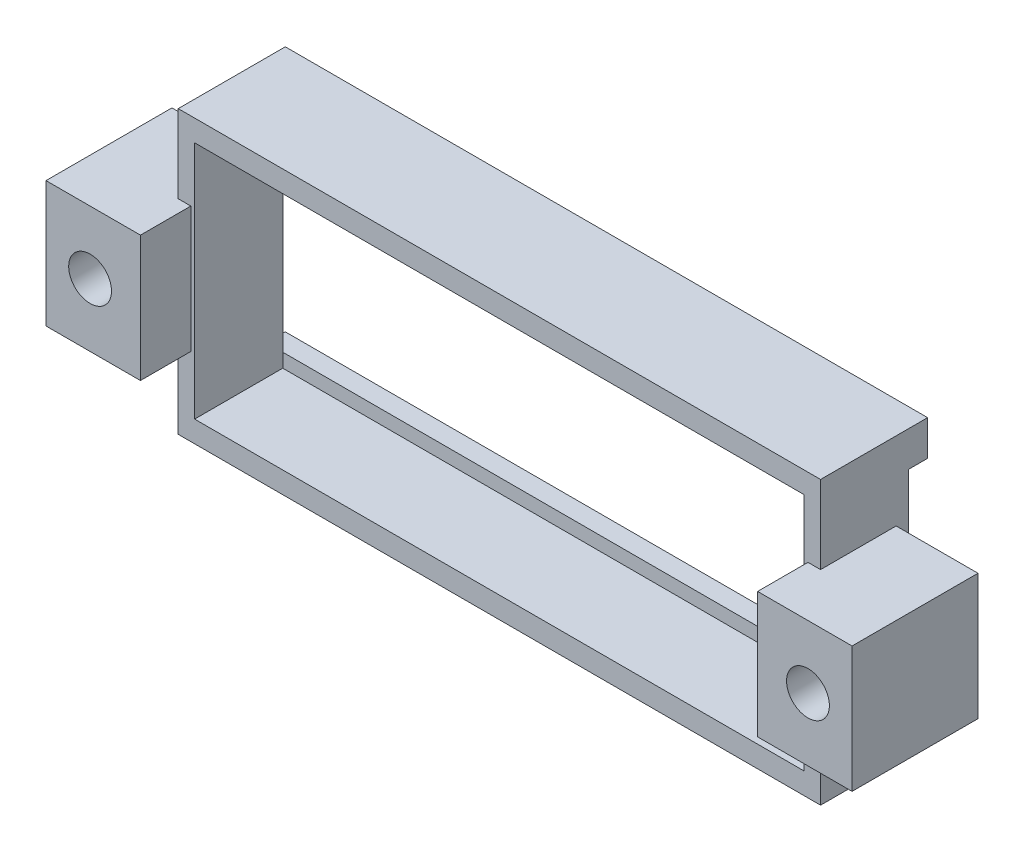
ISO-10303-21;
HEADER;
FILE_DESCRIPTION(('STEP AP214'),'2;1');
FILE_NAME('part.step','',(''),(''),'','','');
FILE_SCHEMA(('AUTOMOTIVE_DESIGN { 1 0 10303 214 1 1 1 1 }'));
ENDSEC;
DATA;
#1=APPLICATION_CONTEXT('core data for automotive mechanical design processes');
#2=APPLICATION_PROTOCOL_DEFINITION('international standard','automotive_design',2000,#1);
#3=PRODUCT_CONTEXT('',#1,'mechanical');
#4=PRODUCT('Part','Part','',(#3));
#5=PRODUCT_RELATED_PRODUCT_CATEGORY('part','',(#4));
#6=PRODUCT_DEFINITION_FORMATION('','',#4);
#7=PRODUCT_DEFINITION_CONTEXT('part definition',#1,'design');
#8=PRODUCT_DEFINITION('design','',#6,#7);
#9=PRODUCT_DEFINITION_SHAPE('','',#8);
#10=(LENGTH_UNIT() NAMED_UNIT(*) SI_UNIT(.MILLI.,.METRE.));
#11=(NAMED_UNIT(*) PLANE_ANGLE_UNIT() SI_UNIT($,.RADIAN.));
#12=(NAMED_UNIT(*) SI_UNIT($,.STERADIAN.) SOLID_ANGLE_UNIT());
#13=UNCERTAINTY_MEASURE_WITH_UNIT(LENGTH_MEASURE(1.E-05),#10,'distance_accuracy_value','');
#14=(GEOMETRIC_REPRESENTATION_CONTEXT(3) GLOBAL_UNCERTAINTY_ASSIGNED_CONTEXT((#13)) GLOBAL_UNIT_ASSIGNED_CONTEXT((#10,
#11,#12)) REPRESENTATION_CONTEXT('',''));
#15=CARTESIAN_POINT('',(0.,0.,0.));
#16=DIRECTION('',(0.,0.,1.));
#17=DIRECTION('',(1.,0.,0.));
#18=AXIS2_PLACEMENT_3D('',#15,#16,#17);
#19=CARTESIAN_POINT('',(0.,0.,18.));
#20=DIRECTION('',(0.,0.,-1.));
#21=DIRECTION('',(-1.,0.,0.));
#22=AXIS2_PLACEMENT_3D('',#19,#20,#21);
#23=PLANE('',#22);
#24=DIRECTION('',(0.,-1.,0.));
#25=VECTOR('',#24,1.);
#26=CARTESIAN_POINT('',(-24.2,-9.5,18.));
#27=LINE('',#26,#25);
#28=CARTESIAN_POINT('',(-24.2,9.5,18.));
#29=VERTEX_POINT('',#28);
#30=CARTESIAN_POINT('',(-24.2,-9.5,18.));
#31=VERTEX_POINT('',#30);
#32=EDGE_CURVE('E324',#29,#31,#27,.T.);
#33=ORIENTED_EDGE('',*,*,#32,.F.);
#34=DIRECTION('',(-1.,0.,0.));
#35=VECTOR('',#34,1.);
#36=CARTESIAN_POINT('',(-24.2,9.5,18.));
#37=LINE('',#36,#35);
#38=CARTESIAN_POINT('',(24.2,9.5,18.));
#39=VERTEX_POINT('',#38);
#40=EDGE_CURVE('E332',#39,#29,#37,.T.);
#41=ORIENTED_EDGE('',*,*,#40,.F.);
#42=DIRECTION('',(0.,1.,0.));
#43=VECTOR('',#42,1.);
#44=CARTESIAN_POINT('',(24.2,-9.5,18.));
#45=LINE('',#44,#43);
#46=CARTESIAN_POINT('',(24.2,-9.5,18.));
#47=VERTEX_POINT('',#46);
#48=EDGE_CURVE('E329',#47,#39,#45,.T.);
#49=ORIENTED_EDGE('',*,*,#48,.F.);
#50=DIRECTION('',(1.,0.,0.));
#51=VECTOR('',#50,1.);
#52=CARTESIAN_POINT('',(-24.2,-9.5,18.));
#53=LINE('',#52,#51);
#54=EDGE_CURVE('E326',#31,#47,#53,.T.);
#55=ORIENTED_EDGE('',*,*,#54,.F.);
#56=EDGE_LOOP('',(#33,#41,#49,#55));
#57=FACE_BOUND('',#56,.T.);
#58=DIRECTION('',(1.,0.,0.));
#59=VECTOR('',#58,1.);
#60=CARTESIAN_POINT('',(0.,-5.,18.));
#61=LINE('',#60,#59);
#62=CARTESIAN_POINT('',(-25.5,-5.,18.));
#63=VERTEX_POINT('',#62);
#64=CARTESIAN_POINT('',(-24.5,-5.,18.));
#65=VERTEX_POINT('',#64);
#66=EDGE_CURVE('E278',#63,#65,#61,.T.);
#67=ORIENTED_EDGE('',*,*,#66,.F.);
#68=DIRECTION('',(0.,-1.,0.));
#69=VECTOR('',#68,1.);
#70=CARTESIAN_POINT('',(-25.5,-11.2,18.));
#71=LINE('',#70,#69);
#72=CARTESIAN_POINT('',(-25.5,-11.2,18.));
#73=VERTEX_POINT('',#72);
#74=EDGE_CURVE('E361',#63,#73,#71,.T.);
#75=ORIENTED_EDGE('',*,*,#74,.T.);
#76=DIRECTION('',(1.,0.,0.));
#77=VECTOR('',#76,1.);
#78=CARTESIAN_POINT('',(-25.5,-11.2,18.));
#79=LINE('',#78,#77);
#80=CARTESIAN_POINT('',(25.5,-11.2,18.));
#81=VERTEX_POINT('',#80);
#82=EDGE_CURVE('E360',#73,#81,#79,.T.);
#83=ORIENTED_EDGE('',*,*,#82,.T.);
#84=DIRECTION('',(0.,1.,0.));
#85=VECTOR('',#84,1.);
#86=CARTESIAN_POINT('',(25.5,-11.2,18.));
#87=LINE('',#86,#85);
#88=CARTESIAN_POINT('',(25.5,-5.,18.));
#89=VERTEX_POINT('',#88);
#90=EDGE_CURVE('E364',#81,#89,#87,.T.);
#91=ORIENTED_EDGE('',*,*,#90,.T.);
#92=DIRECTION('',(1.,0.,0.));
#93=VECTOR('',#92,1.);
#94=CARTESIAN_POINT('',(0.,-5.,18.));
#95=LINE('',#94,#93);
#96=CARTESIAN_POINT('',(24.5,-5.,18.));
#97=VERTEX_POINT('',#96);
#98=EDGE_CURVE('E241',#97,#89,#95,.T.);
#99=ORIENTED_EDGE('',*,*,#98,.F.);
#100=DIRECTION('',(0.,-1.,0.));
#101=VECTOR('',#100,1.);
#102=CARTESIAN_POINT('',(24.5,0.,18.));
#103=LINE('',#102,#101);
#104=CARTESIAN_POINT('',(24.5,5.,18.));
#105=VERTEX_POINT('',#104);
#106=EDGE_CURVE('E50',#105,#97,#103,.T.);
#107=ORIENTED_EDGE('',*,*,#106,.F.);
#108=DIRECTION('',(-1.,0.,0.));
#109=VECTOR('',#108,1.);
#110=CARTESIAN_POINT('',(0.,5.,18.));
#111=LINE('',#110,#109);
#112=CARTESIAN_POINT('',(25.5,5.,18.));
#113=VERTEX_POINT('',#112);
#114=EDGE_CURVE('E239',#113,#105,#111,.T.);
#115=ORIENTED_EDGE('',*,*,#114,.F.);
#116=CARTESIAN_POINT('',(25.5,11.2,18.));
#117=VERTEX_POINT('',#116);
#118=EDGE_CURVE('E363',#113,#117,#87,.T.);
#119=ORIENTED_EDGE('',*,*,#118,.T.);
#120=DIRECTION('',(-1.,0.,0.));
#121=VECTOR('',#120,1.);
#122=CARTESIAN_POINT('',(-25.5,11.2,18.));
#123=LINE('',#122,#121);
#124=CARTESIAN_POINT('',(-25.5,11.2,18.));
#125=VERTEX_POINT('',#124);
#126=EDGE_CURVE('E367',#117,#125,#123,.T.);
#127=ORIENTED_EDGE('',*,*,#126,.T.);
#128=CARTESIAN_POINT('',(-25.5,5.,18.));
#129=VERTEX_POINT('',#128);
#130=EDGE_CURVE('E357',#125,#129,#71,.T.);
#131=ORIENTED_EDGE('',*,*,#130,.T.);
#132=DIRECTION('',(-1.,0.,0.));
#133=VECTOR('',#132,1.);
#134=CARTESIAN_POINT('',(0.,5.,18.));
#135=LINE('',#134,#133);
#136=CARTESIAN_POINT('',(-24.5,5.,18.));
#137=VERTEX_POINT('',#136);
#138=EDGE_CURVE('E276',#137,#129,#135,.T.);
#139=ORIENTED_EDGE('',*,*,#138,.F.);
#140=DIRECTION('',(0.,1.,0.));
#141=VECTOR('',#140,1.);
#142=CARTESIAN_POINT('',(-24.5,0.,18.));
#143=LINE('',#142,#141);
#144=EDGE_CURVE('E11',#65,#137,#143,.T.);
#145=ORIENTED_EDGE('',*,*,#144,.F.);
#146=EDGE_LOOP('',(#67,#75,#83,#91,#99,#107,#115,#119,#127,#131,#139,#145));
#147=FACE_BOUND('',#146,.T.);
#148=ADVANCED_FACE('F41',(#57,#147),#23,.F.);
#149=CARTESIAN_POINT('',(-25.5,-11.2,18.));
#150=DIRECTION('',(1.,0.,0.));
#151=DIRECTION('',(0.,0.,-1.));
#152=AXIS2_PLACEMENT_3D('',#149,#150,#151);
#153=PLANE('',#152);
#154=DIRECTION('',(0.,0.,1.));
#155=VECTOR('',#154,1.);
#156=CARTESIAN_POINT('',(-25.5,-5.,18.));
#157=LINE('',#156,#155);
#158=CARTESIAN_POINT('',(-25.5,-5.,12.));
#159=VERTEX_POINT('',#158);
#160=EDGE_CURVE('E394',#159,#63,#157,.T.);
#161=ORIENTED_EDGE('',*,*,#160,.F.);
#162=DIRECTION('',(0.,1.,0.));
#163=VECTOR('',#162,1.);
#164=CARTESIAN_POINT('',(-25.5,-11.2,12.));
#165=LINE('',#164,#163);
#166=CARTESIAN_POINT('',(-25.5,5.,12.));
#167=VERTEX_POINT('',#166);
#168=EDGE_CURVE('E389',#159,#167,#165,.T.);
#169=ORIENTED_EDGE('',*,*,#168,.T.);
#170=DIRECTION('',(0.,0.,-1.));
#171=VECTOR('',#170,1.);
#172=CARTESIAN_POINT('',(-25.5,5.,18.));
#173=LINE('',#172,#171);
#174=EDGE_CURVE('E392',#129,#167,#173,.T.);
#175=ORIENTED_EDGE('',*,*,#174,.F.);
#176=ORIENTED_EDGE('',*,*,#130,.F.);
#177=DIRECTION('',(0.,0.,-1.));
#178=VECTOR('',#177,1.);
#179=CARTESIAN_POINT('',(-25.5,11.2,18.));
#180=LINE('',#179,#178);
#181=CARTESIAN_POINT('',(-25.5,11.2,9.5));
#182=VERTEX_POINT('',#181);
#183=EDGE_CURVE('E369',#125,#182,#180,.T.);
#184=ORIENTED_EDGE('',*,*,#183,.T.);
#185=DIRECTION('',(0.,-1.,0.));
#186=VECTOR('',#185,1.);
#187=CARTESIAN_POINT('',(-25.5,8.4,9.5));
#188=LINE('',#187,#186);
#189=CARTESIAN_POINT('',(-25.5,8.4,9.5));
#190=VERTEX_POINT('',#189);
#191=EDGE_CURVE('E291',#182,#190,#188,.T.);
#192=ORIENTED_EDGE('',*,*,#191,.T.);
#193=DIRECTION('',(0.,0.,-1.));
#194=VECTOR('',#193,1.);
#195=CARTESIAN_POINT('',(-25.5,8.4,11.));
#196=LINE('',#195,#194);
#197=CARTESIAN_POINT('',(-25.5,8.4,11.));
#198=VERTEX_POINT('',#197);
#199=EDGE_CURVE('E280',#198,#190,#196,.T.);
#200=ORIENTED_EDGE('',*,*,#199,.F.);
#201=DIRECTION('',(0.,-1.,0.));
#202=VECTOR('',#201,1.);
#203=CARTESIAN_POINT('',(-25.5,-11.2,11.));
#204=LINE('',#203,#202);
#205=CARTESIAN_POINT('',(-25.5,-8.4,11.));
#206=VERTEX_POINT('',#205);
#207=EDGE_CURVE('E356',#198,#206,#204,.T.);
#208=ORIENTED_EDGE('',*,*,#207,.T.);
#209=DIRECTION('',(0.,0.,-1.));
#210=VECTOR('',#209,1.);
#211=CARTESIAN_POINT('',(-25.5,-8.4,11.));
#212=LINE('',#211,#210);
#213=CARTESIAN_POINT('',(-25.5,-8.4,9.5));
#214=VERTEX_POINT('',#213);
#215=EDGE_CURVE('E284',#206,#214,#212,.T.);
#216=ORIENTED_EDGE('',*,*,#215,.T.);
#217=DIRECTION('',(0.,-1.,0.));
#218=VECTOR('',#217,1.);
#219=CARTESIAN_POINT('',(-25.5,-11.2,9.5));
#220=LINE('',#219,#218);
#221=CARTESIAN_POINT('',(-25.5,-11.2,9.5));
#222=VERTEX_POINT('',#221);
#223=EDGE_CURVE('E287',#214,#222,#220,.T.);
#224=ORIENTED_EDGE('',*,*,#223,.T.);
#225=DIRECTION('',(0.,0.,-1.));
#226=VECTOR('',#225,1.);
#227=CARTESIAN_POINT('',(-25.5,-11.2,18.));
#228=LINE('',#227,#226);
#229=EDGE_CURVE('E380',#73,#222,#228,.T.);
#230=ORIENTED_EDGE('',*,*,#229,.F.);
#231=ORIENTED_EDGE('',*,*,#74,.F.);
#232=EDGE_LOOP('',(#161,#169,#175,#176,#184,#192,#200,#208,#216,#224,#230,#231));
#233=FACE_BOUND('',#232,.T.);
#234=ADVANCED_FACE('F43',(#233),#153,.F.);
#235=CARTESIAN_POINT('',(25.5,-11.2,18.));
#236=DIRECTION('',(-1.,0.,0.));
#237=DIRECTION('',(0.,0.,1.));
#238=AXIS2_PLACEMENT_3D('',#235,#236,#237);
#239=PLANE('',#238);
#240=DIRECTION('',(0.,0.,-1.));
#241=VECTOR('',#240,1.);
#242=CARTESIAN_POINT('',(25.5,-5.,18.));
#243=LINE('',#242,#241);
#244=CARTESIAN_POINT('',(25.5,-5.,12.));
#245=VERTEX_POINT('',#244);
#246=EDGE_CURVE('E387',#89,#245,#243,.T.);
#247=ORIENTED_EDGE('',*,*,#246,.F.);
#248=ORIENTED_EDGE('',*,*,#90,.F.);
#249=DIRECTION('',(0.,0.,-1.));
#250=VECTOR('',#249,1.);
#251=CARTESIAN_POINT('',(25.5,-11.2,18.));
#252=LINE('',#251,#250);
#253=CARTESIAN_POINT('',(25.5,-11.2,9.5));
#254=VERTEX_POINT('',#253);
#255=EDGE_CURVE('E378',#81,#254,#252,.T.);
#256=ORIENTED_EDGE('',*,*,#255,.T.);
#257=DIRECTION('',(0.,1.,0.));
#258=VECTOR('',#257,1.);
#259=CARTESIAN_POINT('',(25.5,-11.2,9.5));
#260=LINE('',#259,#258);
#261=CARTESIAN_POINT('',(25.5,-8.4,9.5));
#262=VERTEX_POINT('',#261);
#263=EDGE_CURVE('E294',#254,#262,#260,.T.);
#264=ORIENTED_EDGE('',*,*,#263,.T.);
#265=DIRECTION('',(0.,0.,-1.));
#266=VECTOR('',#265,1.);
#267=CARTESIAN_POINT('',(25.5,-8.4,11.));
#268=LINE('',#267,#266);
#269=CARTESIAN_POINT('',(25.5,-8.4,11.));
#270=VERTEX_POINT('',#269);
#271=EDGE_CURVE('E300',#270,#262,#268,.T.);
#272=ORIENTED_EDGE('',*,*,#271,.F.);
#273=DIRECTION('',(0.,1.,0.));
#274=VECTOR('',#273,1.);
#275=CARTESIAN_POINT('',(25.5,-11.2,11.));
#276=LINE('',#275,#274);
#277=CARTESIAN_POINT('',(25.5,8.4,11.));
#278=VERTEX_POINT('',#277);
#279=EDGE_CURVE('E372',#270,#278,#276,.T.);
#280=ORIENTED_EDGE('',*,*,#279,.T.);
#281=DIRECTION('',(0.,0.,-1.));
#282=VECTOR('',#281,1.);
#283=CARTESIAN_POINT('',(25.5,8.4,11.));
#284=LINE('',#283,#282);
#285=CARTESIAN_POINT('',(25.5,8.4,9.5));
#286=VERTEX_POINT('',#285);
#287=EDGE_CURVE('E306',#278,#286,#284,.T.);
#288=ORIENTED_EDGE('',*,*,#287,.T.);
#289=DIRECTION('',(0.,1.,0.));
#290=VECTOR('',#289,1.);
#291=CARTESIAN_POINT('',(25.5,8.4,9.5));
#292=LINE('',#291,#290);
#293=CARTESIAN_POINT('',(25.5,11.2,9.5));
#294=VERTEX_POINT('',#293);
#295=EDGE_CURVE('E313',#286,#294,#292,.T.);
#296=ORIENTED_EDGE('',*,*,#295,.T.);
#297=DIRECTION('',(0.,0.,-1.));
#298=VECTOR('',#297,1.);
#299=CARTESIAN_POINT('',(25.5,11.2,18.));
#300=LINE('',#299,#298);
#301=EDGE_CURVE('E376',#117,#294,#300,.T.);
#302=ORIENTED_EDGE('',*,*,#301,.F.);
#303=ORIENTED_EDGE('',*,*,#118,.F.);
#304=DIRECTION('',(0.,0.,1.));
#305=VECTOR('',#304,1.);
#306=CARTESIAN_POINT('',(25.5,5.,18.));
#307=LINE('',#306,#305);
#308=CARTESIAN_POINT('',(25.5,5.,12.));
#309=VERTEX_POINT('',#308);
#310=EDGE_CURVE('E385',#309,#113,#307,.T.);
#311=ORIENTED_EDGE('',*,*,#310,.F.);
#312=DIRECTION('',(0.,-1.,0.));
#313=VECTOR('',#312,1.);
#314=CARTESIAN_POINT('',(25.5,-11.2,12.));
#315=LINE('',#314,#313);
#316=EDGE_CURVE('E382',#309,#245,#315,.T.);
#317=ORIENTED_EDGE('',*,*,#316,.T.);
#318=EDGE_LOOP('',(#247,#248,#256,#264,#272,#280,#288,#296,#302,#303,#311,#317));
#319=FACE_BOUND('',#318,.T.);
#320=ADVANCED_FACE('F443',(#319),#239,.F.);
#321=CARTESIAN_POINT('',(0.,0.,11.));
#322=DIRECTION('',(0.,0.,-1.));
#323=DIRECTION('',(-1.,0.,0.));
#324=AXIS2_PLACEMENT_3D('',#321,#322,#323);
#325=PLANE('',#324);
#326=ORIENTED_EDGE('',*,*,#279,.F.);
#327=DIRECTION('',(-1.,0.,0.));
#328=VECTOR('',#327,1.);
#329=CARTESIAN_POINT('',(-25.5,-8.4,11.));
#330=LINE('',#329,#328);
#331=CARTESIAN_POINT('',(24.2,-8.4,11.));
#332=VERTEX_POINT('',#331);
#333=EDGE_CURVE('E281',#270,#332,#330,.T.);
#334=ORIENTED_EDGE('',*,*,#333,.T.);
#335=DIRECTION('',(0.,1.,0.));
#336=VECTOR('',#335,1.);
#337=CARTESIAN_POINT('',(24.2,-9.5,11.));
#338=LINE('',#337,#336);
#339=CARTESIAN_POINT('',(24.2,8.4,11.));
#340=VERTEX_POINT('',#339);
#341=EDGE_CURVE('E343',#332,#340,#338,.T.);
#342=ORIENTED_EDGE('',*,*,#341,.T.);
#343=DIRECTION('',(1.,0.,0.));
#344=VECTOR('',#343,1.);
#345=CARTESIAN_POINT('',(-25.5,8.4,11.));
#346=LINE('',#345,#344);
#347=EDGE_CURVE('E323',#340,#278,#346,.T.);
#348=ORIENTED_EDGE('',*,*,#347,.T.);
#349=EDGE_LOOP('',(#326,#334,#342,#348));
#350=FACE_BOUND('',#349,.T.);
#351=ADVANCED_FACE('F512',(#350),#325,.T.);
#352=DIRECTION('',(0.,-1.,0.));
#353=VECTOR('',#352,1.);
#354=CARTESIAN_POINT('',(-24.2,-9.5,11.));
#355=LINE('',#354,#353);
#356=CARTESIAN_POINT('',(-24.2,8.4,11.));
#357=VERTEX_POINT('',#356);
#358=CARTESIAN_POINT('',(-24.2,-8.4,11.));
#359=VERTEX_POINT('',#358);
#360=EDGE_CURVE('E338',#357,#359,#355,.T.);
#361=ORIENTED_EDGE('',*,*,#360,.T.);
#362=EDGE_CURVE('E286',#359,#206,#330,.T.);
#363=ORIENTED_EDGE('',*,*,#362,.T.);
#364=ORIENTED_EDGE('',*,*,#207,.F.);
#365=EDGE_CURVE('E314',#198,#357,#346,.T.);
#366=ORIENTED_EDGE('',*,*,#365,.T.);
#367=EDGE_LOOP('',(#361,#363,#364,#366));
#368=FACE_BOUND('',#367,.T.);
#369=ADVANCED_FACE('F474',(#368),#325,.T.);
#370=CARTESIAN_POINT('',(-25.5,-11.2,18.));
#371=DIRECTION('',(0.,1.,0.));
#372=DIRECTION('',(0.,0.,1.));
#373=AXIS2_PLACEMENT_3D('',#370,#371,#372);
#374=PLANE('',#373);
#375=ORIENTED_EDGE('',*,*,#229,.T.);
#376=DIRECTION('',(1.,0.,0.));
#377=VECTOR('',#376,1.);
#378=CARTESIAN_POINT('',(-25.5,-11.2,9.5));
#379=LINE('',#378,#377);
#380=EDGE_CURVE('E290',#222,#254,#379,.T.);
#381=ORIENTED_EDGE('',*,*,#380,.T.);
#382=ORIENTED_EDGE('',*,*,#255,.F.);
#383=ORIENTED_EDGE('',*,*,#82,.F.);
#384=EDGE_LOOP('',(#375,#381,#382,#383));
#385=FACE_BOUND('',#384,.T.);
#386=ADVANCED_FACE('F437',(#385),#374,.F.);
#387=CARTESIAN_POINT('',(-25.5,11.2,18.));
#388=DIRECTION('',(0.,-1.,0.));
#389=DIRECTION('',(0.,0.,-1.));
#390=AXIS2_PLACEMENT_3D('',#387,#388,#389);
#391=PLANE('',#390);
#392=ORIENTED_EDGE('',*,*,#301,.T.);
#393=DIRECTION('',(-1.,0.,0.));
#394=VECTOR('',#393,1.);
#395=CARTESIAN_POINT('',(-25.5,11.2,9.5));
#396=LINE('',#395,#394);
#397=EDGE_CURVE('E310',#294,#182,#396,.T.);
#398=ORIENTED_EDGE('',*,*,#397,.T.);
#399=ORIENTED_EDGE('',*,*,#183,.F.);
#400=ORIENTED_EDGE('',*,*,#126,.F.);
#401=EDGE_LOOP('',(#392,#398,#399,#400));
#402=FACE_BOUND('',#401,.T.);
#403=ADVANCED_FACE('F464',(#402),#391,.F.);
#404=CARTESIAN_POINT('',(-24.2,-9.5,18.));
#405=DIRECTION('',(1.,0.,0.));
#406=DIRECTION('',(0.,0.,-1.));
#407=AXIS2_PLACEMENT_3D('',#404,#405,#406);
#408=PLANE('',#407);
#409=CARTESIAN_POINT('',(-24.2,9.5,11.));
#410=VERTEX_POINT('',#409);
#411=EDGE_CURVE('E335',#410,#357,#355,.T.);
#412=ORIENTED_EDGE('',*,*,#411,.F.);
#413=DIRECTION('',(0.,0.,-1.));
#414=VECTOR('',#413,1.);
#415=CARTESIAN_POINT('',(-24.2,9.5,18.));
#416=LINE('',#415,#414);
#417=EDGE_CURVE('E334',#29,#410,#416,.T.);
#418=ORIENTED_EDGE('',*,*,#417,.F.);
#419=ORIENTED_EDGE('',*,*,#32,.T.);
#420=DIRECTION('',(0.,0.,-1.));
#421=VECTOR('',#420,1.);
#422=CARTESIAN_POINT('',(-24.2,-9.5,18.));
#423=LINE('',#422,#421);
#424=CARTESIAN_POINT('',(-24.2,-9.5,11.));
#425=VERTEX_POINT('',#424);
#426=EDGE_CURVE('E353',#31,#425,#423,.T.);
#427=ORIENTED_EDGE('',*,*,#426,.T.);
#428=EDGE_CURVE('E303',#359,#425,#355,.T.);
#429=ORIENTED_EDGE('',*,*,#428,.F.);
#430=ORIENTED_EDGE('',*,*,#360,.F.);
#431=EDGE_LOOP('',(#412,#418,#419,#427,#429,#430));
#432=FACE_BOUND('',#431,.T.);
#433=ADVANCED_FACE('F488',(#432),#408,.T.);
#434=CARTESIAN_POINT('',(-24.2,-9.5,18.));
#435=DIRECTION('',(0.,1.,0.));
#436=DIRECTION('',(0.,0.,1.));
#437=AXIS2_PLACEMENT_3D('',#434,#435,#436);
#438=PLANE('',#437);
#439=DIRECTION('',(1.,0.,0.));
#440=VECTOR('',#439,1.);
#441=CARTESIAN_POINT('',(-24.2,-9.5,11.));
#442=LINE('',#441,#440);
#443=CARTESIAN_POINT('',(24.2,-9.5,11.));
#444=VERTEX_POINT('',#443);
#445=EDGE_CURVE('E337',#425,#444,#442,.T.);
#446=ORIENTED_EDGE('',*,*,#445,.F.);
#447=ORIENTED_EDGE('',*,*,#426,.F.);
#448=ORIENTED_EDGE('',*,*,#54,.T.);
#449=DIRECTION('',(0.,0.,-1.));
#450=VECTOR('',#449,1.);
#451=CARTESIAN_POINT('',(24.2,-9.5,18.));
#452=LINE('',#451,#450);
#453=EDGE_CURVE('E350',#47,#444,#452,.T.);
#454=ORIENTED_EDGE('',*,*,#453,.T.);
#455=EDGE_LOOP('',(#446,#447,#448,#454));
#456=FACE_BOUND('',#455,.T.);
#457=ADVANCED_FACE('F494',(#456),#438,.T.);
#458=CARTESIAN_POINT('',(24.2,-9.5,18.));
#459=DIRECTION('',(-1.,0.,0.));
#460=DIRECTION('',(0.,0.,1.));
#461=AXIS2_PLACEMENT_3D('',#458,#459,#460);
#462=PLANE('',#461);
#463=EDGE_CURVE('E341',#444,#332,#338,.T.);
#464=ORIENTED_EDGE('',*,*,#463,.F.);
#465=ORIENTED_EDGE('',*,*,#453,.F.);
#466=ORIENTED_EDGE('',*,*,#48,.T.);
#467=DIRECTION('',(0.,0.,-1.));
#468=VECTOR('',#467,1.);
#469=CARTESIAN_POINT('',(24.2,9.5,18.));
#470=LINE('',#469,#468);
#471=CARTESIAN_POINT('',(24.2,9.5,11.));
#472=VERTEX_POINT('',#471);
#473=EDGE_CURVE('E347',#39,#472,#470,.T.);
#474=ORIENTED_EDGE('',*,*,#473,.T.);
#475=EDGE_CURVE('E340',#340,#472,#338,.T.);
#476=ORIENTED_EDGE('',*,*,#475,.F.);
#477=ORIENTED_EDGE('',*,*,#341,.F.);
#478=EDGE_LOOP('',(#464,#465,#466,#474,#476,#477));
#479=FACE_BOUND('',#478,.T.);
#480=ADVANCED_FACE('F500',(#479),#462,.T.);
#481=CARTESIAN_POINT('',(-24.2,9.5,18.));
#482=DIRECTION('',(0.,-1.,0.));
#483=DIRECTION('',(0.,0.,-1.));
#484=AXIS2_PLACEMENT_3D('',#481,#482,#483);
#485=PLANE('',#484);
#486=DIRECTION('',(-1.,0.,0.));
#487=VECTOR('',#486,1.);
#488=CARTESIAN_POINT('',(-24.2,9.5,11.));
#489=LINE('',#488,#487);
#490=EDGE_CURVE('E327',#472,#410,#489,.T.);
#491=ORIENTED_EDGE('',*,*,#490,.F.);
#492=ORIENTED_EDGE('',*,*,#473,.F.);
#493=ORIENTED_EDGE('',*,*,#40,.T.);
#494=ORIENTED_EDGE('',*,*,#417,.T.);
#495=EDGE_LOOP('',(#491,#492,#493,#494));
#496=FACE_BOUND('',#495,.T.);
#497=ADVANCED_FACE('F577',(#496),#485,.T.);
#498=CARTESIAN_POINT('',(0.,0.,11.));
#499=DIRECTION('',(0.,0.,-1.));
#500=DIRECTION('',(-1.,0.,0.));
#501=AXIS2_PLACEMENT_3D('',#498,#499,#500);
#502=PLANE('',#501);
#503=ORIENTED_EDGE('',*,*,#490,.T.);
#504=ORIENTED_EDGE('',*,*,#411,.T.);
#505=EDGE_CURVE('E309',#357,#340,#346,.T.);
#506=ORIENTED_EDGE('',*,*,#505,.T.);
#507=ORIENTED_EDGE('',*,*,#475,.T.);
#508=EDGE_LOOP('',(#503,#504,#506,#507));
#509=FACE_BOUND('',#508,.T.);
#510=ADVANCED_FACE('F508',(#509),#502,.F.);
#511=CARTESIAN_POINT('',(-25.5,8.4,11.));
#512=DIRECTION('',(0.,1.,0.));
#513=DIRECTION('',(0.,0.,1.));
#514=AXIS2_PLACEMENT_3D('',#511,#512,#513);
#515=PLANE('',#514);
#516=DIRECTION('',(1.,0.,0.));
#517=VECTOR('',#516,1.);
#518=CARTESIAN_POINT('',(-25.5,8.4,9.5));
#519=LINE('',#518,#517);
#520=EDGE_CURVE('E317',#190,#286,#519,.T.);
#521=ORIENTED_EDGE('',*,*,#520,.T.);
#522=ORIENTED_EDGE('',*,*,#287,.F.);
#523=ORIENTED_EDGE('',*,*,#347,.F.);
#524=ORIENTED_EDGE('',*,*,#505,.F.);
#525=ORIENTED_EDGE('',*,*,#365,.F.);
#526=ORIENTED_EDGE('',*,*,#199,.T.);
#527=EDGE_LOOP('',(#521,#522,#523,#524,#525,#526));
#528=FACE_BOUND('',#527,.T.);
#529=ADVANCED_FACE('F510',(#528),#515,.F.);
#530=CARTESIAN_POINT('',(0.,0.,9.5));
#531=DIRECTION('',(0.,0.,-1.));
#532=DIRECTION('',(-1.,0.,0.));
#533=AXIS2_PLACEMENT_3D('',#530,#531,#532);
#534=PLANE('',#533);
#535=ORIENTED_EDGE('',*,*,#191,.F.);
#536=ORIENTED_EDGE('',*,*,#397,.F.);
#537=ORIENTED_EDGE('',*,*,#295,.F.);
#538=ORIENTED_EDGE('',*,*,#520,.F.);
#539=EDGE_LOOP('',(#535,#536,#537,#538));
#540=FACE_BOUND('',#539,.T.);
#541=ADVANCED_FACE('F467',(#540),#534,.T.);
#542=CARTESIAN_POINT('',(0.,0.,11.));
#543=DIRECTION('',(0.,0.,-1.));
#544=DIRECTION('',(-1.,0.,0.));
#545=AXIS2_PLACEMENT_3D('',#542,#543,#544);
#546=PLANE('',#545);
#547=EDGE_CURVE('E285',#332,#359,#330,.T.);
#548=ORIENTED_EDGE('',*,*,#547,.T.);
#549=ORIENTED_EDGE('',*,*,#428,.T.);
#550=ORIENTED_EDGE('',*,*,#445,.T.);
#551=ORIENTED_EDGE('',*,*,#463,.T.);
#552=EDGE_LOOP('',(#548,#549,#550,#551));
#553=FACE_BOUND('',#552,.T.);
#554=ADVANCED_FACE('F482',(#553),#546,.F.);
#555=CARTESIAN_POINT('',(-25.5,-8.4,11.));
#556=DIRECTION('',(0.,-1.,0.));
#557=DIRECTION('',(0.,0.,-1.));
#558=AXIS2_PLACEMENT_3D('',#555,#556,#557);
#559=PLANE('',#558);
#560=DIRECTION('',(-1.,0.,0.));
#561=VECTOR('',#560,1.);
#562=CARTESIAN_POINT('',(-25.5,-8.4,9.5));
#563=LINE('',#562,#561);
#564=EDGE_CURVE('E296',#262,#214,#563,.T.);
#565=ORIENTED_EDGE('',*,*,#564,.T.);
#566=ORIENTED_EDGE('',*,*,#215,.F.);
#567=ORIENTED_EDGE('',*,*,#362,.F.);
#568=ORIENTED_EDGE('',*,*,#547,.F.);
#569=ORIENTED_EDGE('',*,*,#333,.F.);
#570=ORIENTED_EDGE('',*,*,#271,.T.);
#571=EDGE_LOOP('',(#565,#566,#567,#568,#569,#570));
#572=FACE_BOUND('',#571,.T.);
#573=ADVANCED_FACE('F514',(#572),#559,.F.);
#574=CARTESIAN_POINT('',(0.,0.,9.5));
#575=DIRECTION('',(0.,0.,-1.));
#576=DIRECTION('',(-1.,0.,0.));
#577=AXIS2_PLACEMENT_3D('',#574,#575,#576);
#578=PLANE('',#577);
#579=ORIENTED_EDGE('',*,*,#223,.F.);
#580=ORIENTED_EDGE('',*,*,#564,.F.);
#581=ORIENTED_EDGE('',*,*,#263,.F.);
#582=ORIENTED_EDGE('',*,*,#380,.F.);
#583=EDGE_LOOP('',(#579,#580,#581,#582));
#584=FACE_BOUND('',#583,.T.);
#585=ADVANCED_FACE('F516',(#584),#578,.T.);
#586=CARTESIAN_POINT('',(24.5,-5.,22.));
#587=DIRECTION('',(1.,0.,0.));
#588=DIRECTION('',(0.,0.,-1.));
#589=AXIS2_PLACEMENT_3D('',#586,#587,#588);
#590=PLANE('',#589);
#591=DIRECTION('',(0.,0.,-1.));
#592=VECTOR('',#591,1.);
#593=CARTESIAN_POINT('',(24.5,5.,22.));
#594=LINE('',#593,#592);
#595=CARTESIAN_POINT('',(24.5,5.,22.));
#596=VERTEX_POINT('',#595);
#597=EDGE_CURVE('E257',#596,#105,#594,.T.);
#598=ORIENTED_EDGE('',*,*,#597,.T.);
#599=ORIENTED_EDGE('',*,*,#106,.T.);
#600=DIRECTION('',(0.,0.,-1.));
#601=VECTOR('',#600,1.);
#602=CARTESIAN_POINT('',(24.5,-5.,22.));
#603=LINE('',#602,#601);
#604=CARTESIAN_POINT('',(24.5,-5.,22.));
#605=VERTEX_POINT('',#604);
#606=EDGE_CURVE('E247',#605,#97,#603,.T.);
#607=ORIENTED_EDGE('',*,*,#606,.F.);
#608=DIRECTION('',(0.,-1.,0.));
#609=VECTOR('',#608,1.);
#610=CARTESIAN_POINT('',(24.5,-5.,22.));
#611=LINE('',#610,#609);
#612=EDGE_CURVE('E265',#596,#605,#611,.T.);
#613=ORIENTED_EDGE('',*,*,#612,.F.);
#614=EDGE_LOOP('',(#598,#599,#607,#613));
#615=FACE_BOUND('',#614,.T.);
#616=ADVANCED_FACE('F453',(#615),#590,.F.);
#617=CARTESIAN_POINT('',(24.5,-5.,22.));
#618=DIRECTION('',(0.,1.,0.));
#619=DIRECTION('',(0.,0.,1.));
#620=AXIS2_PLACEMENT_3D('',#617,#618,#619);
#621=PLANE('',#620);
#622=ORIENTED_EDGE('',*,*,#606,.T.);
#623=ORIENTED_EDGE('',*,*,#98,.T.);
#624=ORIENTED_EDGE('',*,*,#246,.T.);
#625=DIRECTION('',(1.,0.,0.));
#626=VECTOR('',#625,1.);
#627=CARTESIAN_POINT('',(24.5,-5.,12.));
#628=LINE('',#627,#626);
#629=CARTESIAN_POINT('',(32.,-5.,12.));
#630=VERTEX_POINT('',#629);
#631=EDGE_CURVE('E66',#245,#630,#628,.T.);
#632=ORIENTED_EDGE('',*,*,#631,.T.);
#633=DIRECTION('',(0.,0.,-1.));
#634=VECTOR('',#633,1.);
#635=CARTESIAN_POINT('',(32.,-5.,22.));
#636=LINE('',#635,#634);
#637=CARTESIAN_POINT('',(32.,-5.,22.));
#638=VERTEX_POINT('',#637);
#639=EDGE_CURVE('E250',#638,#630,#636,.T.);
#640=ORIENTED_EDGE('',*,*,#639,.F.);
#641=DIRECTION('',(1.,0.,0.));
#642=VECTOR('',#641,1.);
#643=CARTESIAN_POINT('',(24.5,-5.,22.));
#644=LINE('',#643,#642);
#645=EDGE_CURVE('E271',#605,#638,#644,.T.);
#646=ORIENTED_EDGE('',*,*,#645,.F.);
#647=EDGE_LOOP('',(#622,#623,#624,#632,#640,#646));
#648=FACE_BOUND('',#647,.T.);
#649=ADVANCED_FACE('F448',(#648),#621,.F.);
#650=CARTESIAN_POINT('',(24.5,5.,22.));
#651=DIRECTION('',(0.,-1.,0.));
#652=DIRECTION('',(0.,0.,-1.));
#653=AXIS2_PLACEMENT_3D('',#650,#651,#652);
#654=PLANE('',#653);
#655=ORIENTED_EDGE('',*,*,#310,.T.);
#656=ORIENTED_EDGE('',*,*,#114,.T.);
#657=ORIENTED_EDGE('',*,*,#597,.F.);
#658=DIRECTION('',(-1.,0.,0.));
#659=VECTOR('',#658,1.);
#660=CARTESIAN_POINT('',(24.5,5.,22.));
#661=LINE('',#660,#659);
#662=CARTESIAN_POINT('',(32.,5.,22.));
#663=VERTEX_POINT('',#662);
#664=EDGE_CURVE('E260',#663,#596,#661,.T.);
#665=ORIENTED_EDGE('',*,*,#664,.F.);
#666=DIRECTION('',(0.,0.,-1.));
#667=VECTOR('',#666,1.);
#668=CARTESIAN_POINT('',(32.,5.,22.));
#669=LINE('',#668,#667);
#670=CARTESIAN_POINT('',(32.,5.,12.));
#671=VERTEX_POINT('',#670);
#672=EDGE_CURVE('E254',#663,#671,#669,.T.);
#673=ORIENTED_EDGE('',*,*,#672,.T.);
#674=DIRECTION('',(-1.,0.,0.));
#675=VECTOR('',#674,1.);
#676=CARTESIAN_POINT('',(24.5,5.,12.));
#677=LINE('',#676,#675);
#678=EDGE_CURVE('E261',#671,#309,#677,.T.);
#679=ORIENTED_EDGE('',*,*,#678,.T.);
#680=EDGE_LOOP('',(#655,#656,#657,#665,#673,#679));
#681=FACE_BOUND('',#680,.T.);
#682=ADVANCED_FACE('F457',(#681),#654,.F.);
#683=CARTESIAN_POINT('',(0.,0.,12.));
#684=DIRECTION('',(0.,0.,-1.));
#685=DIRECTION('',(-1.,0.,0.));
#686=AXIS2_PLACEMENT_3D('',#683,#684,#685);
#687=PLANE('',#686);
#688=CARTESIAN_POINT('',(28.5,0.,12.));
#689=DIRECTION('',(0.,0.,-1.));
#690=DIRECTION('',(-1.,0.,0.));
#691=AXIS2_PLACEMENT_3D('',#688,#689,#690);
#692=CIRCLE('',#691,1.7);
#693=CARTESIAN_POINT('',(26.8,0.,12.));
#694=VERTEX_POINT('',#693);
#695=EDGE_CURVE('E251',#694,#694,#692,.T.);
#696=ORIENTED_EDGE('',*,*,#695,.F.);
#697=EDGE_LOOP('',(#696));
#698=FACE_BOUND('',#697,.T.);
#699=ORIENTED_EDGE('',*,*,#316,.F.);
#700=ORIENTED_EDGE('',*,*,#678,.F.);
#701=DIRECTION('',(0.,1.,0.));
#702=VECTOR('',#701,1.);
#703=CARTESIAN_POINT('',(32.,-5.,12.));
#704=LINE('',#703,#702);
#705=EDGE_CURVE('E264',#630,#671,#704,.T.);
#706=ORIENTED_EDGE('',*,*,#705,.F.);
#707=ORIENTED_EDGE('',*,*,#631,.F.);
#708=EDGE_LOOP('',(#699,#700,#706,#707));
#709=FACE_BOUND('',#708,.T.);
#710=ADVANCED_FACE('F660',(#698,#709),#687,.T.);
#711=CARTESIAN_POINT('',(32.,-5.,22.));
#712=DIRECTION('',(-1.,0.,0.));
#713=DIRECTION('',(0.,0.,1.));
#714=AXIS2_PLACEMENT_3D('',#711,#712,#713);
#715=PLANE('',#714);
#716=ORIENTED_EDGE('',*,*,#705,.T.);
#717=ORIENTED_EDGE('',*,*,#672,.F.);
#718=DIRECTION('',(0.,1.,0.));
#719=VECTOR('',#718,1.);
#720=CARTESIAN_POINT('',(32.,-5.,22.));
#721=LINE('',#720,#719);
#722=EDGE_CURVE('E269',#638,#663,#721,.T.);
#723=ORIENTED_EDGE('',*,*,#722,.F.);
#724=ORIENTED_EDGE('',*,*,#639,.T.);
#725=EDGE_LOOP('',(#716,#717,#723,#724));
#726=FACE_BOUND('',#725,.T.);
#727=ADVANCED_FACE('F670',(#726),#715,.F.);
#728=CARTESIAN_POINT('',(0.,0.,22.));
#729=DIRECTION('',(0.,0.,-1.));
#730=DIRECTION('',(-1.,0.,0.));
#731=AXIS2_PLACEMENT_3D('',#728,#729,#730);
#732=PLANE('',#731);
#733=CARTESIAN_POINT('',(28.5,0.,22.));
#734=DIRECTION('',(0.,0.,-1.));
#735=DIRECTION('',(-1.,0.,0.));
#736=AXIS2_PLACEMENT_3D('',#733,#734,#735);
#737=CIRCLE('',#736,1.7);
#738=CARTESIAN_POINT('',(26.8,0.,22.));
#739=VERTEX_POINT('',#738);
#740=EDGE_CURVE('E45',#739,#739,#737,.T.);
#741=ORIENTED_EDGE('',*,*,#740,.T.);
#742=EDGE_LOOP('',(#741));
#743=FACE_BOUND('',#742,.T.);
#744=ORIENTED_EDGE('',*,*,#612,.T.);
#745=ORIENTED_EDGE('',*,*,#645,.T.);
#746=ORIENTED_EDGE('',*,*,#722,.T.);
#747=ORIENTED_EDGE('',*,*,#664,.T.);
#748=EDGE_LOOP('',(#744,#745,#746,#747));
#749=FACE_BOUND('',#748,.T.);
#750=ADVANCED_FACE('F681',(#743,#749),#732,.F.);
#751=CARTESIAN_POINT('',(-24.5,-5.,22.));
#752=DIRECTION('',(-1.,0.,0.));
#753=DIRECTION('',(0.,0.,1.));
#754=AXIS2_PLACEMENT_3D('',#751,#752,#753);
#755=PLANE('',#754);
#756=DIRECTION('',(0.,0.,-1.));
#757=VECTOR('',#756,1.);
#758=CARTESIAN_POINT('',(-24.5,-5.,22.));
#759=LINE('',#758,#757);
#760=CARTESIAN_POINT('',(-24.5,-5.,22.));
#761=VERTEX_POINT('',#760);
#762=EDGE_CURVE('E223',#761,#65,#759,.T.);
#763=ORIENTED_EDGE('',*,*,#762,.T.);
#764=ORIENTED_EDGE('',*,*,#144,.T.);
#765=DIRECTION('',(0.,0.,-1.));
#766=VECTOR('',#765,1.);
#767=CARTESIAN_POINT('',(-24.5,5.,22.));
#768=LINE('',#767,#766);
#769=CARTESIAN_POINT('',(-24.5,5.,22.));
#770=VERTEX_POINT('',#769);
#771=EDGE_CURVE('E243',#770,#137,#768,.T.);
#772=ORIENTED_EDGE('',*,*,#771,.F.);
#773=DIRECTION('',(0.,1.,0.));
#774=VECTOR('',#773,1.);
#775=CARTESIAN_POINT('',(-24.5,-5.,22.));
#776=LINE('',#775,#774);
#777=EDGE_CURVE('E226',#761,#770,#776,.T.);
#778=ORIENTED_EDGE('',*,*,#777,.F.);
#779=EDGE_LOOP('',(#763,#764,#772,#778));
#780=FACE_BOUND('',#779,.T.);
#781=ADVANCED_FACE('F691',(#780),#755,.F.);
#782=CARTESIAN_POINT('',(-32.,-5.,22.));
#783=DIRECTION('',(0.,1.,0.));
#784=DIRECTION('',(0.,0.,1.));
#785=AXIS2_PLACEMENT_3D('',#782,#783,#784);
#786=PLANE('',#785);
#787=ORIENTED_EDGE('',*,*,#160,.T.);
#788=ORIENTED_EDGE('',*,*,#66,.T.);
#789=ORIENTED_EDGE('',*,*,#762,.F.);
#790=DIRECTION('',(1.,0.,0.));
#791=VECTOR('',#790,1.);
#792=CARTESIAN_POINT('',(-32.,-5.,22.));
#793=LINE('',#792,#791);
#794=CARTESIAN_POINT('',(-32.,-5.,22.));
#795=VERTEX_POINT('',#794);
#796=EDGE_CURVE('E215',#795,#761,#793,.T.);
#797=ORIENTED_EDGE('',*,*,#796,.F.);
#798=DIRECTION('',(0.,0.,-1.));
#799=VECTOR('',#798,1.);
#800=CARTESIAN_POINT('',(-32.,-5.,22.));
#801=LINE('',#800,#799);
#802=CARTESIAN_POINT('',(-32.,-5.,12.));
#803=VERTEX_POINT('',#802);
#804=EDGE_CURVE('E220',#795,#803,#801,.T.);
#805=ORIENTED_EDGE('',*,*,#804,.T.);
#806=DIRECTION('',(1.,0.,0.));
#807=VECTOR('',#806,1.);
#808=CARTESIAN_POINT('',(-32.,-5.,12.));
#809=LINE('',#808,#807);
#810=EDGE_CURVE('E413',#803,#159,#809,.T.);
#811=ORIENTED_EDGE('',*,*,#810,.T.);
#812=EDGE_LOOP('',(#787,#788,#789,#797,#805,#811));
#813=FACE_BOUND('',#812,.T.);
#814=ADVANCED_FACE('F217',(#813),#786,.F.);
#815=CARTESIAN_POINT('',(-32.,5.,22.));
#816=DIRECTION('',(0.,-1.,0.));
#817=DIRECTION('',(0.,0.,-1.));
#818=AXIS2_PLACEMENT_3D('',#815,#816,#817);
#819=PLANE('',#818);
#820=ORIENTED_EDGE('',*,*,#771,.T.);
#821=ORIENTED_EDGE('',*,*,#138,.T.);
#822=ORIENTED_EDGE('',*,*,#174,.T.);
#823=DIRECTION('',(-1.,0.,0.));
#824=VECTOR('',#823,1.);
#825=CARTESIAN_POINT('',(-32.,5.,12.));
#826=LINE('',#825,#824);
#827=CARTESIAN_POINT('',(-32.,5.,12.));
#828=VERTEX_POINT('',#827);
#829=EDGE_CURVE('E58',#167,#828,#826,.T.);
#830=ORIENTED_EDGE('',*,*,#829,.T.);
#831=DIRECTION('',(0.,0.,-1.));
#832=VECTOR('',#831,1.);
#833=CARTESIAN_POINT('',(-32.,5.,22.));
#834=LINE('',#833,#832);
#835=CARTESIAN_POINT('',(-32.,5.,22.));
#836=VERTEX_POINT('',#835);
#837=EDGE_CURVE('E411',#836,#828,#834,.T.);
#838=ORIENTED_EDGE('',*,*,#837,.F.);
#839=DIRECTION('',(-1.,0.,0.));
#840=VECTOR('',#839,1.);
#841=CARTESIAN_POINT('',(-32.,5.,22.));
#842=LINE('',#841,#840);
#843=EDGE_CURVE('E232',#770,#836,#842,.T.);
#844=ORIENTED_EDGE('',*,*,#843,.F.);
#845=EDGE_LOOP('',(#820,#821,#822,#830,#838,#844));
#846=FACE_BOUND('',#845,.T.);
#847=ADVANCED_FACE('F420',(#846),#819,.F.);
#848=CARTESIAN_POINT('',(0.,0.,12.));
#849=DIRECTION('',(0.,0.,-1.));
#850=DIRECTION('',(-1.,0.,0.));
#851=AXIS2_PLACEMENT_3D('',#848,#849,#850);
#852=PLANE('',#851);
#853=CARTESIAN_POINT('',(-28.5,0.,12.));
#854=DIRECTION('',(0.,0.,-1.));
#855=DIRECTION('',(-1.,0.,0.));
#856=AXIS2_PLACEMENT_3D('',#853,#854,#855);
#857=CIRCLE('',#856,1.7);
#858=CARTESIAN_POINT('',(-30.2,0.,12.));
#859=VERTEX_POINT('',#858);
#860=EDGE_CURVE('E398',#859,#859,#857,.T.);
#861=ORIENTED_EDGE('',*,*,#860,.F.);
#862=EDGE_LOOP('',(#861));
#863=FACE_BOUND('',#862,.T.);
#864=ORIENTED_EDGE('',*,*,#168,.F.);
#865=ORIENTED_EDGE('',*,*,#810,.F.);
#866=DIRECTION('',(0.,-1.,0.));
#867=VECTOR('',#866,1.);
#868=CARTESIAN_POINT('',(-32.,-5.,12.));
#869=LINE('',#868,#867);
#870=EDGE_CURVE('E238',#828,#803,#869,.T.);
#871=ORIENTED_EDGE('',*,*,#870,.F.);
#872=ORIENTED_EDGE('',*,*,#829,.F.);
#873=EDGE_LOOP('',(#864,#865,#871,#872));
#874=FACE_BOUND('',#873,.T.);
#875=ADVANCED_FACE('F431',(#863,#874),#852,.T.);
#876=CARTESIAN_POINT('',(-32.,-5.,22.));
#877=DIRECTION('',(1.,0.,0.));
#878=DIRECTION('',(0.,0.,-1.));
#879=AXIS2_PLACEMENT_3D('',#876,#877,#878);
#880=PLANE('',#879);
#881=ORIENTED_EDGE('',*,*,#870,.T.);
#882=ORIENTED_EDGE('',*,*,#804,.F.);
#883=DIRECTION('',(0.,-1.,0.));
#884=VECTOR('',#883,1.);
#885=CARTESIAN_POINT('',(-32.,-5.,22.));
#886=LINE('',#885,#884);
#887=EDGE_CURVE('E227',#836,#795,#886,.T.);
#888=ORIENTED_EDGE('',*,*,#887,.F.);
#889=ORIENTED_EDGE('',*,*,#837,.T.);
#890=EDGE_LOOP('',(#881,#882,#888,#889));
#891=FACE_BOUND('',#890,.T.);
#892=ADVANCED_FACE('F237',(#891),#880,.F.);
#893=CARTESIAN_POINT('',(0.,0.,22.));
#894=DIRECTION('',(0.,0.,-1.));
#895=DIRECTION('',(-1.,0.,0.));
#896=AXIS2_PLACEMENT_3D('',#893,#894,#895);
#897=PLANE('',#896);
#898=CARTESIAN_POINT('',(-28.5,0.,22.));
#899=DIRECTION('',(0.,0.,-1.));
#900=DIRECTION('',(-1.,0.,0.));
#901=AXIS2_PLACEMENT_3D('',#898,#899,#900);
#902=CIRCLE('',#901,1.7);
#903=CARTESIAN_POINT('',(-30.2,0.,22.));
#904=VERTEX_POINT('',#903);
#905=EDGE_CURVE('E396',#904,#904,#902,.T.);
#906=ORIENTED_EDGE('',*,*,#905,.T.);
#907=EDGE_LOOP('',(#906));
#908=FACE_BOUND('',#907,.T.);
#909=ORIENTED_EDGE('',*,*,#887,.T.);
#910=ORIENTED_EDGE('',*,*,#796,.T.);
#911=ORIENTED_EDGE('',*,*,#777,.T.);
#912=ORIENTED_EDGE('',*,*,#843,.T.);
#913=EDGE_LOOP('',(#909,#910,#911,#912));
#914=FACE_BOUND('',#913,.T.);
#915=ADVANCED_FACE('F230',(#908,#914),#897,.F.);
#916=CARTESIAN_POINT('',(-28.5,0.,11.));
#917=DIRECTION('',(0.,0.,1.));
#918=DIRECTION('',(1.,0.,0.));
#919=AXIS2_PLACEMENT_3D('',#916,#917,#918);
#920=CYLINDRICAL_SURFACE('',#919,1.7);
#921=ORIENTED_EDGE('',*,*,#860,.T.);
#922=EDGE_LOOP('',(#921));
#923=FACE_BOUND('',#922,.T.);
#924=ORIENTED_EDGE('',*,*,#905,.F.);
#925=EDGE_LOOP('',(#924));
#926=FACE_BOUND('',#925,.T.);
#927=ADVANCED_FACE('F740',(#923,#926),#920,.F.);
#928=CARTESIAN_POINT('',(28.5,0.,11.));
#929=DIRECTION('',(0.,0.,1.));
#930=DIRECTION('',(1.,0.,0.));
#931=AXIS2_PLACEMENT_3D('',#928,#929,#930);
#932=CYLINDRICAL_SURFACE('',#931,1.7);
#933=ORIENTED_EDGE('',*,*,#695,.T.);
#934=EDGE_LOOP('',(#933));
#935=FACE_BOUND('',#934,.T.);
#936=ORIENTED_EDGE('',*,*,#740,.F.);
#937=EDGE_LOOP('',(#936));
#938=FACE_BOUND('',#937,.T.);
#939=ADVANCED_FACE('F749',(#935,#938),#932,.F.);
#940=CLOSED_SHELL('',(#148,#234,#320,#351,#369,#386,#403,#433,#457,#480,#497,#510,#529,#541,
#554,#573,#585,#616,#649,#682,#710,#727,#750,#781,#814,#847,#875,#892,#915,#927,#939));
#941=MANIFOLD_SOLID_BREP('B2',#940);
#942=ADVANCED_BREP_SHAPE_REPRESENTATION('',(#18,#941),#14);
#943=SHAPE_DEFINITION_REPRESENTATION(#9,#942);
ENDSEC;
END-ISO-10303-21;
